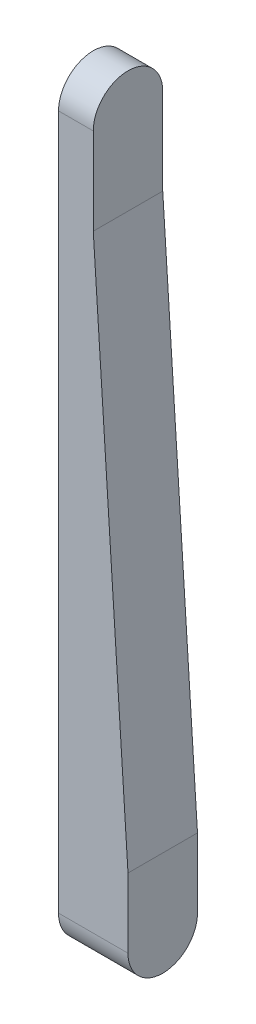
ISO-10303-21;
HEADER;
FILE_DESCRIPTION(('STEP AP214'),'2;1');
FILE_NAME('part.step','',(''),(''),'','','');
FILE_SCHEMA(('AUTOMOTIVE_DESIGN { 1 0 10303 214 1 1 1 1 }'));
ENDSEC;
DATA;
#1=APPLICATION_CONTEXT('core data for automotive mechanical design processes');
#2=APPLICATION_PROTOCOL_DEFINITION('international standard','automotive_design',2000,#1);
#3=PRODUCT_CONTEXT('',#1,'mechanical');
#4=PRODUCT('Part','Part','',(#3));
#5=PRODUCT_RELATED_PRODUCT_CATEGORY('part','',(#4));
#6=PRODUCT_DEFINITION_FORMATION('','',#4);
#7=PRODUCT_DEFINITION_CONTEXT('part definition',#1,'design');
#8=PRODUCT_DEFINITION('design','',#6,#7);
#9=PRODUCT_DEFINITION_SHAPE('','',#8);
#10=(LENGTH_UNIT() NAMED_UNIT(*) SI_UNIT(.MILLI.,.METRE.));
#11=(NAMED_UNIT(*) PLANE_ANGLE_UNIT() SI_UNIT($,.RADIAN.));
#12=(NAMED_UNIT(*) SI_UNIT($,.STERADIAN.) SOLID_ANGLE_UNIT());
#13=UNCERTAINTY_MEASURE_WITH_UNIT(LENGTH_MEASURE(1.E-05),#10,'distance_accuracy_value','');
#14=(GEOMETRIC_REPRESENTATION_CONTEXT(3) GLOBAL_UNCERTAINTY_ASSIGNED_CONTEXT((#13)) GLOBAL_UNIT_ASSIGNED_CONTEXT((#10,
#11,#12)) REPRESENTATION_CONTEXT('',''));
#15=CARTESIAN_POINT('',(0.,0.,0.));
#16=DIRECTION('',(0.,0.,1.));
#17=DIRECTION('',(1.,0.,0.));
#18=AXIS2_PLACEMENT_3D('',#15,#16,#17);
#19=CARTESIAN_POINT('',(20.,0.,0.));
#20=DIRECTION('',(-1.,0.,0.));
#21=DIRECTION('',(0.,0.,1.));
#22=AXIS2_PLACEMENT_3D('',#19,#20,#21);
#23=PLANE('',#22);
#24=DIRECTION('',(0.,-1.,0.));
#25=VECTOR('',#24,1.);
#26=CARTESIAN_POINT('',(20.,438.,20.));
#27=LINE('',#26,#25);
#28=CARTESIAN_POINT('',(20.,838.,20.));
#29=VERTEX_POINT('',#28);
#30=CARTESIAN_POINT('',(20.,438.,20.));
#31=VERTEX_POINT('',#30);
#32=EDGE_CURVE('E174',#29,#31,#27,.T.);
#33=ORIENTED_EDGE('',*,*,#32,.F.);
#34=CARTESIAN_POINT('',(20.,838.,0.));
#35=DIRECTION('',(1.,0.,0.));
#36=DIRECTION('',(0.,0.,-1.));
#37=AXIS2_PLACEMENT_3D('',#34,#35,#36);
#38=CIRCLE('',#37,20.);
#39=CARTESIAN_POINT('',(20.,838.,-20.));
#40=VERTEX_POINT('',#39);
#41=EDGE_CURVE('E118',#40,#29,#38,.T.);
#42=ORIENTED_EDGE('',*,*,#41,.F.);
#43=DIRECTION('',(0.,1.,0.));
#44=VECTOR('',#43,1.);
#45=CARTESIAN_POINT('',(20.,438.,-20.));
#46=LINE('',#45,#44);
#47=CARTESIAN_POINT('',(20.,438.,-20.));
#48=VERTEX_POINT('',#47);
#49=EDGE_CURVE('E100',#48,#40,#46,.T.);
#50=ORIENTED_EDGE('',*,*,#49,.F.);
#51=CARTESIAN_POINT('',(20.,438.,0.));
#52=DIRECTION('',(1.,0.,0.));
#53=DIRECTION('',(0.,0.,-1.));
#54=AXIS2_PLACEMENT_3D('',#51,#52,#53);
#55=CIRCLE('',#54,20.);
#56=EDGE_CURVE('E46',#31,#48,#55,.T.);
#57=ORIENTED_EDGE('',*,*,#56,.F.);
#58=EDGE_LOOP('',(#33,#42,#50,#57));
#59=FACE_BOUND('',#58,.T.);
#60=ADVANCED_FACE('F35',(#59),#23,.T.);
#61=CARTESIAN_POINT('',(60.,438.,0.));
#62=DIRECTION('',(1.,0.,0.));
#63=DIRECTION('',(0.,0.,-1.));
#64=AXIS2_PLACEMENT_3D('',#61,#62,#63);
#65=PLANE('',#64);
#66=CARTESIAN_POINT('',(60.,438.,0.));
#67=DIRECTION('',(1.,0.,0.));
#68=DIRECTION('',(0.,0.,-1.));
#69=AXIS2_PLACEMENT_3D('',#66,#67,#68);
#70=CIRCLE('',#69,20.);
#71=CARTESIAN_POINT('',(60.,438.,20.));
#72=VERTEX_POINT('',#71);
#73=CARTESIAN_POINT('',(60.,438.,-20.));
#74=VERTEX_POINT('',#73);
#75=EDGE_CURVE('E11',#72,#74,#70,.T.);
#76=ORIENTED_EDGE('',*,*,#75,.T.);
#77=DIRECTION('',(0.,1.,0.));
#78=VECTOR('',#77,1.);
#79=CARTESIAN_POINT('',(60.,438.,-20.));
#80=LINE('',#79,#78);
#81=CARTESIAN_POINT('',(60.,478.,-20.));
#82=VERTEX_POINT('',#81);
#83=EDGE_CURVE('E64',#74,#82,#80,.T.);
#84=ORIENTED_EDGE('',*,*,#83,.T.);
#85=DIRECTION('',(0.,0.,-1.));
#86=VECTOR('',#85,1.);
#87=CARTESIAN_POINT('',(60.,478.,0.));
#88=LINE('',#87,#86);
#89=CARTESIAN_POINT('',(60.,478.,20.));
#90=VERTEX_POINT('',#89);
#91=EDGE_CURVE('E177',#82,#90,#88,.F.);
#92=ORIENTED_EDGE('',*,*,#91,.T.);
#93=DIRECTION('',(0.,-1.,0.));
#94=VECTOR('',#93,1.);
#95=CARTESIAN_POINT('',(60.,438.,20.));
#96=LINE('',#95,#94);
#97=EDGE_CURVE('E54',#90,#72,#96,.T.);
#98=ORIENTED_EDGE('',*,*,#97,.T.);
#99=EDGE_LOOP('',(#76,#84,#92,#98));
#100=FACE_BOUND('',#99,.T.);
#101=ADVANCED_FACE('F148',(#100),#65,.T.);
#102=CARTESIAN_POINT('',(90.4621761658031,5.83626943005182,0.));
#103=DIRECTION('',(-0.997925308968458,-0.0643822779979651,0.));
#104=DIRECTION('',(0.0643822779979651,-0.997925308968458,0.));
#105=AXIS2_PLACEMENT_3D('',#102,#103,#104);
#106=PLANE('',#105);
#107=DIRECTION('',(-0.0643822779979651,0.997925308968458,0.));
#108=VECTOR('',#107,1.);
#109=CARTESIAN_POINT('',(60.,478.,-20.));
#110=LINE('',#109,#108);
#111=CARTESIAN_POINT('',(40.,788.,-20.));
#112=VERTEX_POINT('',#111);
#113=EDGE_CURVE('E78',#82,#112,#110,.T.);
#114=ORIENTED_EDGE('',*,*,#113,.T.);
#115=DIRECTION('',(0.,0.,-1.));
#116=VECTOR('',#115,1.);
#117=CARTESIAN_POINT('',(40.,788.,-20.));
#118=LINE('',#117,#116);
#119=CARTESIAN_POINT('',(40.,788.,20.));
#120=VERTEX_POINT('',#119);
#121=EDGE_CURVE('E39',#120,#112,#118,.T.);
#122=ORIENTED_EDGE('',*,*,#121,.F.);
#123=DIRECTION('',(-0.0643822779979651,0.997925308968458,0.));
#124=VECTOR('',#123,1.);
#125=CARTESIAN_POINT('',(60.,478.,20.));
#126=LINE('',#125,#124);
#127=EDGE_CURVE('E124',#90,#120,#126,.T.);
#128=ORIENTED_EDGE('',*,*,#127,.F.);
#129=ORIENTED_EDGE('',*,*,#91,.F.);
#130=EDGE_LOOP('',(#114,#122,#128,#129));
#131=FACE_BOUND('',#130,.T.);
#132=ADVANCED_FACE('F138',(#131),#106,.F.);
#133=CARTESIAN_POINT('',(20.,438.,-20.));
#134=DIRECTION('',(0.,0.,-1.));
#135=DIRECTION('',(-1.,0.,0.));
#136=AXIS2_PLACEMENT_3D('',#133,#134,#135);
#137=PLANE('',#136);
#138=ORIENTED_EDGE('',*,*,#83,.F.);
#139=DIRECTION('',(1.,0.,0.));
#140=VECTOR('',#139,1.);
#141=CARTESIAN_POINT('',(20.,438.,-20.));
#142=LINE('',#141,#140);
#143=EDGE_CURVE('E169',#48,#74,#142,.T.);
#144=ORIENTED_EDGE('',*,*,#143,.F.);
#145=ORIENTED_EDGE('',*,*,#49,.T.);
#146=DIRECTION('',(-1.,0.,0.));
#147=VECTOR('',#146,1.);
#148=CARTESIAN_POINT('',(20.,838.,-20.));
#149=LINE('',#148,#147);
#150=CARTESIAN_POINT('',(40.,838.,-20.));
#151=VERTEX_POINT('',#150);
#152=EDGE_CURVE('E95',#151,#40,#149,.T.);
#153=ORIENTED_EDGE('',*,*,#152,.F.);
#154=DIRECTION('',(0.,-1.,0.));
#155=VECTOR('',#154,1.);
#156=CARTESIAN_POINT('',(40.,838.,-20.));
#157=LINE('',#156,#155);
#158=EDGE_CURVE('E98',#151,#112,#157,.T.);
#159=ORIENTED_EDGE('',*,*,#158,.T.);
#160=ORIENTED_EDGE('',*,*,#113,.F.);
#161=EDGE_LOOP('',(#138,#144,#145,#153,#159,#160));
#162=FACE_BOUND('',#161,.T.);
#163=ADVANCED_FACE('F97',(#162),#137,.T.);
#164=CARTESIAN_POINT('',(40.,838.,-20.));
#165=DIRECTION('',(-1.,0.,0.));
#166=DIRECTION('',(0.,0.,1.));
#167=AXIS2_PLACEMENT_3D('',#164,#165,#166);
#168=PLANE('',#167);
#169=ORIENTED_EDGE('',*,*,#158,.F.);
#170=CARTESIAN_POINT('',(40.,838.,0.));
#171=DIRECTION('',(1.,0.,0.));
#172=DIRECTION('',(0.,0.,-1.));
#173=AXIS2_PLACEMENT_3D('',#170,#171,#172);
#174=CIRCLE('',#173,20.);
#175=CARTESIAN_POINT('',(40.,838.,20.));
#176=VERTEX_POINT('',#175);
#177=EDGE_CURVE('E111',#151,#176,#174,.T.);
#178=ORIENTED_EDGE('',*,*,#177,.T.);
#179=DIRECTION('',(0.,-1.,0.));
#180=VECTOR('',#179,1.);
#181=CARTESIAN_POINT('',(40.,838.,20.));
#182=LINE('',#181,#180);
#183=EDGE_CURVE('E113',#176,#120,#182,.T.);
#184=ORIENTED_EDGE('',*,*,#183,.T.);
#185=ORIENTED_EDGE('',*,*,#121,.T.);
#186=EDGE_LOOP('',(#169,#178,#184,#185));
#187=FACE_BOUND('',#186,.T.);
#188=ADVANCED_FACE('F109',(#187),#168,.F.);
#189=CARTESIAN_POINT('',(20.,838.,0.));
#190=DIRECTION('',(1.,0.,0.));
#191=DIRECTION('',(0.,0.,-1.));
#192=AXIS2_PLACEMENT_3D('',#189,#190,#191);
#193=CYLINDRICAL_SURFACE('',#192,20.);
#194=ORIENTED_EDGE('',*,*,#41,.T.);
#195=DIRECTION('',(1.,0.,0.));
#196=VECTOR('',#195,1.);
#197=CARTESIAN_POINT('',(20.,838.,20.));
#198=LINE('',#197,#196);
#199=EDGE_CURVE('E105',#29,#176,#198,.T.);
#200=ORIENTED_EDGE('',*,*,#199,.T.);
#201=ORIENTED_EDGE('',*,*,#177,.F.);
#202=ORIENTED_EDGE('',*,*,#152,.T.);
#203=EDGE_LOOP('',(#194,#200,#201,#202));
#204=FACE_BOUND('',#203,.T.);
#205=ADVANCED_FACE('F116',(#204),#193,.T.);
#206=CARTESIAN_POINT('',(20.,438.,20.));
#207=DIRECTION('',(0.,0.,1.));
#208=DIRECTION('',(0.,-1.,0.));
#209=AXIS2_PLACEMENT_3D('',#206,#207,#208);
#210=PLANE('',#209);
#211=ORIENTED_EDGE('',*,*,#97,.F.);
#212=ORIENTED_EDGE('',*,*,#127,.T.);
#213=ORIENTED_EDGE('',*,*,#183,.F.);
#214=ORIENTED_EDGE('',*,*,#199,.F.);
#215=ORIENTED_EDGE('',*,*,#32,.T.);
#216=DIRECTION('',(1.,0.,0.));
#217=VECTOR('',#216,1.);
#218=CARTESIAN_POINT('',(20.,438.,20.));
#219=LINE('',#218,#217);
#220=EDGE_CURVE('E168',#31,#72,#219,.T.);
#221=ORIENTED_EDGE('',*,*,#220,.T.);
#222=EDGE_LOOP('',(#211,#212,#213,#214,#215,#221));
#223=FACE_BOUND('',#222,.T.);
#224=ADVANCED_FACE('F154',(#223),#210,.T.);
#225=CARTESIAN_POINT('',(20.,438.,0.));
#226=DIRECTION('',(-1.,0.,0.));
#227=DIRECTION('',(0.,0.,1.));
#228=AXIS2_PLACEMENT_3D('',#225,#226,#227);
#229=CYLINDRICAL_SURFACE('',#228,20.);
#230=ORIENTED_EDGE('',*,*,#75,.F.);
#231=ORIENTED_EDGE('',*,*,#220,.F.);
#232=ORIENTED_EDGE('',*,*,#56,.T.);
#233=ORIENTED_EDGE('',*,*,#143,.T.);
#234=EDGE_LOOP('',(#230,#231,#232,#233));
#235=FACE_BOUND('',#234,.T.);
#236=ADVANCED_FACE('F37',(#235),#229,.T.);
#237=CLOSED_SHELL('',(#60,#101,#132,#163,#188,#205,#224,#236));
#238=MANIFOLD_SOLID_BREP('B2',#237);
#239=ADVANCED_BREP_SHAPE_REPRESENTATION('',(#18,#238),#14);
#240=SHAPE_DEFINITION_REPRESENTATION(#9,#239);
ENDSEC;
END-ISO-10303-21;
